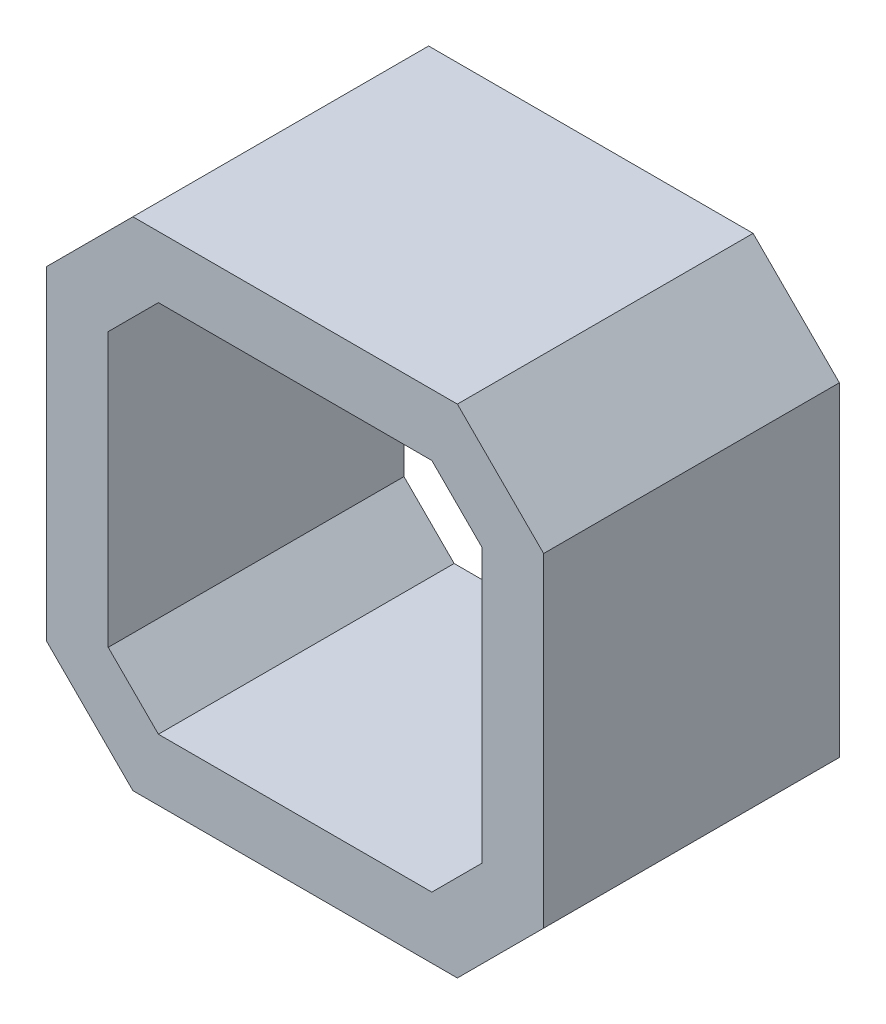
ISO-10303-21;
HEADER;
FILE_DESCRIPTION(('STEP AP214'),'2;1');
FILE_NAME('part.step','',(''),(''),'','','');
FILE_SCHEMA(('AUTOMOTIVE_DESIGN { 1 0 10303 214 1 1 1 1 }'));
ENDSEC;
DATA;
#1=APPLICATION_CONTEXT('core data for automotive mechanical design processes');
#2=APPLICATION_PROTOCOL_DEFINITION('international standard','automotive_design',2000,#1);
#3=PRODUCT_CONTEXT('',#1,'mechanical');
#4=PRODUCT('Part','Part','',(#3));
#5=PRODUCT_RELATED_PRODUCT_CATEGORY('part','',(#4));
#6=PRODUCT_DEFINITION_FORMATION('','',#4);
#7=PRODUCT_DEFINITION_CONTEXT('part definition',#1,'design');
#8=PRODUCT_DEFINITION('design','',#6,#7);
#9=PRODUCT_DEFINITION_SHAPE('','',#8);
#10=(LENGTH_UNIT() NAMED_UNIT(*) SI_UNIT(.MILLI.,.METRE.));
#11=(NAMED_UNIT(*) PLANE_ANGLE_UNIT() SI_UNIT($,.RADIAN.));
#12=(NAMED_UNIT(*) SI_UNIT($,.STERADIAN.) SOLID_ANGLE_UNIT());
#13=UNCERTAINTY_MEASURE_WITH_UNIT(LENGTH_MEASURE(1.E-05),#10,'distance_accuracy_value','');
#14=(GEOMETRIC_REPRESENTATION_CONTEXT(3) GLOBAL_UNCERTAINTY_ASSIGNED_CONTEXT((#13)) GLOBAL_UNIT_ASSIGNED_CONTEXT((#10,
#11,#12)) REPRESENTATION_CONTEXT('',''));
#15=CARTESIAN_POINT('',(0.,0.,0.));
#16=DIRECTION('',(0.,0.,1.));
#17=DIRECTION('',(1.,0.,0.));
#18=AXIS2_PLACEMENT_3D('',#15,#16,#17);
#19=CARTESIAN_POINT('',(0.,0.,54.));
#20=DIRECTION('',(0.,0.,-1.));
#21=DIRECTION('',(-1.,0.,0.));
#22=AXIS2_PLACEMENT_3D('',#19,#20,#21);
#23=PLANE('',#22);
#24=DIRECTION('',(-1.,0.,0.));
#25=VECTOR('',#24,1.);
#26=CARTESIAN_POINT('',(19.75,30.25,54.));
#27=LINE('',#26,#25);
#28=CARTESIAN_POINT('',(19.75,30.25,54.));
#29=VERTEX_POINT('',#28);
#30=CARTESIAN_POINT('',(-19.75,30.25,54.));
#31=VERTEX_POINT('',#30);
#32=EDGE_CURVE('E213',#29,#31,#27,.T.);
#33=ORIENTED_EDGE('',*,*,#32,.T.);
#34=DIRECTION('',(-0.707106781186548,-0.707106781186548,0.));
#35=VECTOR('',#34,1.);
#36=CARTESIAN_POINT('',(-19.75,30.25,54.));
#37=LINE('',#36,#35);
#38=CARTESIAN_POINT('',(-30.25,19.75,54.));
#39=VERTEX_POINT('',#38);
#40=EDGE_CURVE('E216',#31,#39,#37,.T.);
#41=ORIENTED_EDGE('',*,*,#40,.T.);
#42=DIRECTION('',(0.,-1.,0.));
#43=VECTOR('',#42,1.);
#44=CARTESIAN_POINT('',(-30.25,-19.75,54.));
#45=LINE('',#44,#43);
#46=CARTESIAN_POINT('',(-30.25,-19.75,54.));
#47=VERTEX_POINT('',#46);
#48=EDGE_CURVE('E219',#39,#47,#45,.T.);
#49=ORIENTED_EDGE('',*,*,#48,.T.);
#50=DIRECTION('',(0.707106781186548,-0.707106781186547,0.));
#51=VECTOR('',#50,1.);
#52=CARTESIAN_POINT('',(-19.75,-30.25,54.));
#53=LINE('',#52,#51);
#54=CARTESIAN_POINT('',(-19.75,-30.25,54.));
#55=VERTEX_POINT('',#54);
#56=EDGE_CURVE('E221',#47,#55,#53,.T.);
#57=ORIENTED_EDGE('',*,*,#56,.T.);
#58=DIRECTION('',(1.,0.,0.));
#59=VECTOR('',#58,1.);
#60=CARTESIAN_POINT('',(19.75,-30.25,54.));
#61=LINE('',#60,#59);
#62=CARTESIAN_POINT('',(19.75,-30.25,54.));
#63=VERTEX_POINT('',#62);
#64=EDGE_CURVE('E223',#55,#63,#61,.T.);
#65=ORIENTED_EDGE('',*,*,#64,.T.);
#66=DIRECTION('',(0.707106781186548,0.707106781186547,0.));
#67=VECTOR('',#66,1.);
#68=CARTESIAN_POINT('',(30.25,-19.75,54.));
#69=LINE('',#68,#67);
#70=CARTESIAN_POINT('',(30.25,-19.75,54.));
#71=VERTEX_POINT('',#70);
#72=EDGE_CURVE('E225',#63,#71,#69,.T.);
#73=ORIENTED_EDGE('',*,*,#72,.T.);
#74=DIRECTION('',(0.,1.,0.));
#75=VECTOR('',#74,1.);
#76=CARTESIAN_POINT('',(30.25,-19.75,54.));
#77=LINE('',#76,#75);
#78=CARTESIAN_POINT('',(30.25,19.75,54.));
#79=VERTEX_POINT('',#78);
#80=EDGE_CURVE('E227',#71,#79,#77,.T.);
#81=ORIENTED_EDGE('',*,*,#80,.T.);
#82=DIRECTION('',(-0.707106781186548,0.707106781186548,0.));
#83=VECTOR('',#82,1.);
#84=CARTESIAN_POINT('',(30.25,19.75,54.));
#85=LINE('',#84,#83);
#86=EDGE_CURVE('E229',#79,#29,#85,.T.);
#87=ORIENTED_EDGE('',*,*,#86,.T.);
#88=EDGE_LOOP('',(#33,#41,#49,#57,#65,#73,#81,#87));
#89=FACE_BOUND('',#88,.T.);
#90=DIRECTION('',(-0.707106781186548,0.707106781186548,0.));
#91=VECTOR('',#90,1.);
#92=CARTESIAN_POINT('',(22.75,16.6433982822018,54.));
#93=LINE('',#92,#91);
#94=CARTESIAN_POINT('',(22.75,16.6433982822018,54.));
#95=VERTEX_POINT('',#94);
#96=CARTESIAN_POINT('',(16.6433982822018,22.75,54.));
#97=VERTEX_POINT('',#96);
#98=EDGE_CURVE('E148',#95,#97,#93,.T.);
#99=ORIENTED_EDGE('',*,*,#98,.F.);
#100=DIRECTION('',(0.,1.,0.));
#101=VECTOR('',#100,1.);
#102=CARTESIAN_POINT('',(22.75,-16.6433982822018,54.));
#103=LINE('',#102,#101);
#104=CARTESIAN_POINT('',(22.75,-16.6433982822018,54.));
#105=VERTEX_POINT('',#104);
#106=EDGE_CURVE('E181',#105,#95,#103,.T.);
#107=ORIENTED_EDGE('',*,*,#106,.F.);
#108=DIRECTION('',(0.707106781186548,0.707106781186547,0.));
#109=VECTOR('',#108,1.);
#110=CARTESIAN_POINT('',(22.75,-16.6433982822018,54.));
#111=LINE('',#110,#109);
#112=CARTESIAN_POINT('',(16.6433982822018,-22.75,54.));
#113=VERTEX_POINT('',#112);
#114=EDGE_CURVE('E179',#113,#105,#111,.T.);
#115=ORIENTED_EDGE('',*,*,#114,.F.);
#116=DIRECTION('',(1.,0.,0.));
#117=VECTOR('',#116,1.);
#118=CARTESIAN_POINT('',(16.6433982822018,-22.75,54.));
#119=LINE('',#118,#117);
#120=CARTESIAN_POINT('',(-16.6433982822018,-22.75,54.));
#121=VERTEX_POINT('',#120);
#122=EDGE_CURVE('E177',#121,#113,#119,.T.);
#123=ORIENTED_EDGE('',*,*,#122,.F.);
#124=DIRECTION('',(0.707106781186548,-0.707106781186547,0.));
#125=VECTOR('',#124,1.);
#126=CARTESIAN_POINT('',(-16.6433982822018,-22.75,54.));
#127=LINE('',#126,#125);
#128=CARTESIAN_POINT('',(-22.75,-16.6433982822018,54.));
#129=VERTEX_POINT('',#128);
#130=EDGE_CURVE('E175',#129,#121,#127,.T.);
#131=ORIENTED_EDGE('',*,*,#130,.F.);
#132=DIRECTION('',(0.,-1.,0.));
#133=VECTOR('',#132,1.);
#134=CARTESIAN_POINT('',(-22.75,-16.6433982822018,54.));
#135=LINE('',#134,#133);
#136=CARTESIAN_POINT('',(-22.75,16.6433982822018,54.));
#137=VERTEX_POINT('',#136);
#138=EDGE_CURVE('E171',#137,#129,#135,.T.);
#139=ORIENTED_EDGE('',*,*,#138,.F.);
#140=DIRECTION('',(-0.707106781186547,-0.707106781186548,0.));
#141=VECTOR('',#140,1.);
#142=CARTESIAN_POINT('',(-16.6433982822018,22.75,54.));
#143=LINE('',#142,#141);
#144=CARTESIAN_POINT('',(-16.6433982822018,22.75,54.));
#145=VERTEX_POINT('',#144);
#146=EDGE_CURVE('E169',#145,#137,#143,.T.);
#147=ORIENTED_EDGE('',*,*,#146,.F.);
#148=DIRECTION('',(-1.,0.,0.));
#149=VECTOR('',#148,1.);
#150=CARTESIAN_POINT('',(16.6433982822018,22.75,54.));
#151=LINE('',#150,#149);
#152=EDGE_CURVE('E156',#97,#145,#151,.T.);
#153=ORIENTED_EDGE('',*,*,#152,.F.);
#154=EDGE_LOOP('',(#99,#107,#115,#123,#131,#139,#147,#153));
#155=FACE_BOUND('',#154,.T.);
#156=ADVANCED_FACE('F35',(#89,#155),#23,.F.);
#157=CARTESIAN_POINT('',(0.,0.,18.));
#158=DIRECTION('',(0.,0.,-1.));
#159=DIRECTION('',(-1.,0.,0.));
#160=AXIS2_PLACEMENT_3D('',#157,#158,#159);
#161=PLANE('',#160);
#162=DIRECTION('',(-1.,0.,0.));
#163=VECTOR('',#162,1.);
#164=CARTESIAN_POINT('',(19.75,30.25,18.));
#165=LINE('',#164,#163);
#166=CARTESIAN_POINT('',(19.75,30.25,18.));
#167=VERTEX_POINT('',#166);
#168=CARTESIAN_POINT('',(-19.75,30.25,18.));
#169=VERTEX_POINT('',#168);
#170=EDGE_CURVE('E164',#167,#169,#165,.T.);
#171=ORIENTED_EDGE('',*,*,#170,.F.);
#172=DIRECTION('',(-0.707106781186548,0.707106781186548,0.));
#173=VECTOR('',#172,1.);
#174=CARTESIAN_POINT('',(30.25,19.75,18.));
#175=LINE('',#174,#173);
#176=CARTESIAN_POINT('',(30.25,19.75,18.));
#177=VERTEX_POINT('',#176);
#178=EDGE_CURVE('E217',#177,#167,#175,.T.);
#179=ORIENTED_EDGE('',*,*,#178,.F.);
#180=DIRECTION('',(0.,1.,0.));
#181=VECTOR('',#180,1.);
#182=CARTESIAN_POINT('',(30.25,-19.75,18.));
#183=LINE('',#182,#181);
#184=CARTESIAN_POINT('',(30.25,-19.75,18.));
#185=VERTEX_POINT('',#184);
#186=EDGE_CURVE('E244',#185,#177,#183,.T.);
#187=ORIENTED_EDGE('',*,*,#186,.F.);
#188=DIRECTION('',(0.707106781186548,0.707106781186547,0.));
#189=VECTOR('',#188,1.);
#190=CARTESIAN_POINT('',(30.25,-19.75,18.));
#191=LINE('',#190,#189);
#192=CARTESIAN_POINT('',(19.75,-30.25,18.));
#193=VERTEX_POINT('',#192);
#194=EDGE_CURVE('E242',#193,#185,#191,.T.);
#195=ORIENTED_EDGE('',*,*,#194,.F.);
#196=DIRECTION('',(1.,0.,0.));
#197=VECTOR('',#196,1.);
#198=CARTESIAN_POINT('',(19.75,-30.25,18.));
#199=LINE('',#198,#197);
#200=CARTESIAN_POINT('',(-19.75,-30.25,18.));
#201=VERTEX_POINT('',#200);
#202=EDGE_CURVE('E240',#201,#193,#199,.T.);
#203=ORIENTED_EDGE('',*,*,#202,.F.);
#204=DIRECTION('',(0.707106781186548,-0.707106781186547,0.));
#205=VECTOR('',#204,1.);
#206=CARTESIAN_POINT('',(-19.75,-30.25,18.));
#207=LINE('',#206,#205);
#208=CARTESIAN_POINT('',(-30.25,-19.75,18.));
#209=VERTEX_POINT('',#208);
#210=EDGE_CURVE('E238',#209,#201,#207,.T.);
#211=ORIENTED_EDGE('',*,*,#210,.F.);
#212=DIRECTION('',(0.,-1.,0.));
#213=VECTOR('',#212,1.);
#214=CARTESIAN_POINT('',(-30.25,-19.75,18.));
#215=LINE('',#214,#213);
#216=CARTESIAN_POINT('',(-30.25,19.75,18.));
#217=VERTEX_POINT('',#216);
#218=EDGE_CURVE('E236',#217,#209,#215,.T.);
#219=ORIENTED_EDGE('',*,*,#218,.F.);
#220=DIRECTION('',(-0.707106781186548,-0.707106781186548,0.));
#221=VECTOR('',#220,1.);
#222=CARTESIAN_POINT('',(-19.75,30.25,18.));
#223=LINE('',#222,#221);
#224=EDGE_CURVE('E234',#169,#217,#223,.T.);
#225=ORIENTED_EDGE('',*,*,#224,.F.);
#226=EDGE_LOOP('',(#171,#179,#187,#195,#203,#211,#219,#225));
#227=FACE_BOUND('',#226,.T.);
#228=DIRECTION('',(0.,1.,0.));
#229=VECTOR('',#228,1.);
#230=CARTESIAN_POINT('',(22.75,-16.6433982822018,18.));
#231=LINE('',#230,#229);
#232=CARTESIAN_POINT('',(22.75,-16.6433982822018,18.));
#233=VERTEX_POINT('',#232);
#234=CARTESIAN_POINT('',(22.75,16.6433982822018,18.));
#235=VERTEX_POINT('',#234);
#236=EDGE_CURVE('E157',#233,#235,#231,.T.);
#237=ORIENTED_EDGE('',*,*,#236,.T.);
#238=DIRECTION('',(-0.707106781186548,0.707106781186548,0.));
#239=VECTOR('',#238,1.);
#240=CARTESIAN_POINT('',(22.75,16.6433982822018,18.));
#241=LINE('',#240,#239);
#242=CARTESIAN_POINT('',(16.6433982822018,22.75,18.));
#243=VERTEX_POINT('',#242);
#244=EDGE_CURVE('E58',#235,#243,#241,.T.);
#245=ORIENTED_EDGE('',*,*,#244,.T.);
#246=DIRECTION('',(-1.,0.,0.));
#247=VECTOR('',#246,1.);
#248=CARTESIAN_POINT('',(16.6433982822018,22.75,18.));
#249=LINE('',#248,#247);
#250=CARTESIAN_POINT('',(-16.6433982822018,22.75,18.));
#251=VERTEX_POINT('',#250);
#252=EDGE_CURVE('E163',#243,#251,#249,.T.);
#253=ORIENTED_EDGE('',*,*,#252,.T.);
#254=DIRECTION('',(-0.707106781186547,-0.707106781186548,0.));
#255=VECTOR('',#254,1.);
#256=CARTESIAN_POINT('',(-16.6433982822018,22.75,18.));
#257=LINE('',#256,#255);
#258=CARTESIAN_POINT('',(-22.75,16.6433982822018,18.));
#259=VERTEX_POINT('',#258);
#260=EDGE_CURVE('E185',#251,#259,#257,.T.);
#261=ORIENTED_EDGE('',*,*,#260,.T.);
#262=DIRECTION('',(0.,-1.,0.));
#263=VECTOR('',#262,1.);
#264=CARTESIAN_POINT('',(-22.75,-16.6433982822018,18.));
#265=LINE('',#264,#263);
#266=CARTESIAN_POINT('',(-22.75,-16.6433982822018,18.));
#267=VERTEX_POINT('',#266);
#268=EDGE_CURVE('E188',#259,#267,#265,.T.);
#269=ORIENTED_EDGE('',*,*,#268,.T.);
#270=DIRECTION('',(0.707106781186548,-0.707106781186547,0.));
#271=VECTOR('',#270,1.);
#272=CARTESIAN_POINT('',(-16.6433982822018,-22.75,18.));
#273=LINE('',#272,#271);
#274=CARTESIAN_POINT('',(-16.6433982822018,-22.75,18.));
#275=VERTEX_POINT('',#274);
#276=EDGE_CURVE('E191',#267,#275,#273,.T.);
#277=ORIENTED_EDGE('',*,*,#276,.T.);
#278=DIRECTION('',(1.,0.,0.));
#279=VECTOR('',#278,1.);
#280=CARTESIAN_POINT('',(16.6433982822018,-22.75,18.));
#281=LINE('',#280,#279);
#282=CARTESIAN_POINT('',(16.6433982822018,-22.75,18.));
#283=VERTEX_POINT('',#282);
#284=EDGE_CURVE('E194',#275,#283,#281,.T.);
#285=ORIENTED_EDGE('',*,*,#284,.T.);
#286=DIRECTION('',(0.707106781186548,0.707106781186547,0.));
#287=VECTOR('',#286,1.);
#288=CARTESIAN_POINT('',(22.75,-16.6433982822018,18.));
#289=LINE('',#288,#287);
#290=EDGE_CURVE('E197',#283,#233,#289,.T.);
#291=ORIENTED_EDGE('',*,*,#290,.T.);
#292=EDGE_LOOP('',(#237,#245,#253,#261,#269,#277,#285,#291));
#293=FACE_BOUND('',#292,.T.);
#294=ADVANCED_FACE('F274',(#227,#293),#161,.T.);
#295=CARTESIAN_POINT('',(19.75,30.25,54.));
#296=DIRECTION('',(0.,-1.,0.));
#297=DIRECTION('',(1.,0.,0.));
#298=AXIS2_PLACEMENT_3D('',#295,#296,#297);
#299=PLANE('',#298);
#300=ORIENTED_EDGE('',*,*,#170,.T.);
#301=DIRECTION('',(0.,0.,-1.));
#302=VECTOR('',#301,1.);
#303=CARTESIAN_POINT('',(-19.75,30.25,54.));
#304=LINE('',#303,#302);
#305=EDGE_CURVE('E11',#31,#169,#304,.T.);
#306=ORIENTED_EDGE('',*,*,#305,.F.);
#307=ORIENTED_EDGE('',*,*,#32,.F.);
#308=DIRECTION('',(0.,0.,-1.));
#309=VECTOR('',#308,1.);
#310=CARTESIAN_POINT('',(19.75,30.25,54.));
#311=LINE('',#310,#309);
#312=EDGE_CURVE('E231',#29,#167,#311,.T.);
#313=ORIENTED_EDGE('',*,*,#312,.T.);
#314=EDGE_LOOP('',(#300,#306,#307,#313));
#315=FACE_BOUND('',#314,.T.);
#316=ADVANCED_FACE('F37',(#315),#299,.F.);
#317=CARTESIAN_POINT('',(-19.75,30.25,54.));
#318=DIRECTION('',(0.707106781186548,-0.707106781186548,0.));
#319=DIRECTION('',(0.707106781186548,0.707106781186548,0.));
#320=AXIS2_PLACEMENT_3D('',#317,#318,#319);
#321=PLANE('',#320);
#322=ORIENTED_EDGE('',*,*,#224,.T.);
#323=DIRECTION('',(0.,0.,-1.));
#324=VECTOR('',#323,1.);
#325=CARTESIAN_POINT('',(-30.25,19.75,54.));
#326=LINE('',#325,#324);
#327=EDGE_CURVE('E43',#39,#217,#326,.T.);
#328=ORIENTED_EDGE('',*,*,#327,.F.);
#329=ORIENTED_EDGE('',*,*,#40,.F.);
#330=ORIENTED_EDGE('',*,*,#305,.T.);
#331=EDGE_LOOP('',(#322,#328,#329,#330));
#332=FACE_BOUND('',#331,.T.);
#333=ADVANCED_FACE('F291',(#332),#321,.F.);
#334=CARTESIAN_POINT('',(-30.25,-19.75,54.));
#335=DIRECTION('',(1.,0.,0.));
#336=DIRECTION('',(0.,0.,-1.));
#337=AXIS2_PLACEMENT_3D('',#334,#335,#336);
#338=PLANE('',#337);
#339=ORIENTED_EDGE('',*,*,#218,.T.);
#340=DIRECTION('',(0.,0.,-1.));
#341=VECTOR('',#340,1.);
#342=CARTESIAN_POINT('',(-30.25,-19.75,54.));
#343=LINE('',#342,#341);
#344=EDGE_CURVE('E261',#47,#209,#343,.T.);
#345=ORIENTED_EDGE('',*,*,#344,.F.);
#346=ORIENTED_EDGE('',*,*,#48,.F.);
#347=ORIENTED_EDGE('',*,*,#327,.T.);
#348=EDGE_LOOP('',(#339,#345,#346,#347));
#349=FACE_BOUND('',#348,.T.);
#350=ADVANCED_FACE('F268',(#349),#338,.F.);
#351=CARTESIAN_POINT('',(-19.75,-30.25,54.));
#352=DIRECTION('',(0.707106781186547,0.707106781186548,0.));
#353=DIRECTION('',(-0.707106781186548,0.707106781186547,0.));
#354=AXIS2_PLACEMENT_3D('',#351,#352,#353);
#355=PLANE('',#354);
#356=ORIENTED_EDGE('',*,*,#210,.T.);
#357=DIRECTION('',(0.,0.,-1.));
#358=VECTOR('',#357,1.);
#359=CARTESIAN_POINT('',(-19.75,-30.25,54.));
#360=LINE('',#359,#358);
#361=EDGE_CURVE('E258',#55,#201,#360,.T.);
#362=ORIENTED_EDGE('',*,*,#361,.F.);
#363=ORIENTED_EDGE('',*,*,#56,.F.);
#364=ORIENTED_EDGE('',*,*,#344,.T.);
#365=EDGE_LOOP('',(#356,#362,#363,#364));
#366=FACE_BOUND('',#365,.T.);
#367=ADVANCED_FACE('F280',(#366),#355,.F.);
#368=CARTESIAN_POINT('',(19.75,-30.25,54.));
#369=DIRECTION('',(0.,1.,0.));
#370=DIRECTION('',(-1.,0.,0.));
#371=AXIS2_PLACEMENT_3D('',#368,#369,#370);
#372=PLANE('',#371);
#373=ORIENTED_EDGE('',*,*,#202,.T.);
#374=DIRECTION('',(0.,0.,-1.));
#375=VECTOR('',#374,1.);
#376=CARTESIAN_POINT('',(19.75,-30.25,54.));
#377=LINE('',#376,#375);
#378=EDGE_CURVE('E255',#63,#193,#377,.T.);
#379=ORIENTED_EDGE('',*,*,#378,.F.);
#380=ORIENTED_EDGE('',*,*,#64,.F.);
#381=ORIENTED_EDGE('',*,*,#361,.T.);
#382=EDGE_LOOP('',(#373,#379,#380,#381));
#383=FACE_BOUND('',#382,.T.);
#384=ADVANCED_FACE('F284',(#383),#372,.F.);
#385=CARTESIAN_POINT('',(30.25,-19.75,54.));
#386=DIRECTION('',(-0.707106781186547,0.707106781186548,0.));
#387=DIRECTION('',(-0.707106781186548,-0.707106781186547,0.));
#388=AXIS2_PLACEMENT_3D('',#385,#386,#387);
#389=PLANE('',#388);
#390=ORIENTED_EDGE('',*,*,#194,.T.);
#391=DIRECTION('',(0.,0.,-1.));
#392=VECTOR('',#391,1.);
#393=CARTESIAN_POINT('',(30.25,-19.75,54.));
#394=LINE('',#393,#392);
#395=EDGE_CURVE('E252',#71,#185,#394,.T.);
#396=ORIENTED_EDGE('',*,*,#395,.F.);
#397=ORIENTED_EDGE('',*,*,#72,.F.);
#398=ORIENTED_EDGE('',*,*,#378,.T.);
#399=EDGE_LOOP('',(#390,#396,#397,#398));
#400=FACE_BOUND('',#399,.T.);
#401=ADVANCED_FACE('F304',(#400),#389,.F.);
#402=CARTESIAN_POINT('',(30.25,-19.75,54.));
#403=DIRECTION('',(-1.,0.,0.));
#404=DIRECTION('',(0.,0.,1.));
#405=AXIS2_PLACEMENT_3D('',#402,#403,#404);
#406=PLANE('',#405);
#407=ORIENTED_EDGE('',*,*,#186,.T.);
#408=DIRECTION('',(0.,0.,-1.));
#409=VECTOR('',#408,1.);
#410=CARTESIAN_POINT('',(30.25,19.75,54.));
#411=LINE('',#410,#409);
#412=EDGE_CURVE('E249',#79,#177,#411,.T.);
#413=ORIENTED_EDGE('',*,*,#412,.F.);
#414=ORIENTED_EDGE('',*,*,#80,.F.);
#415=ORIENTED_EDGE('',*,*,#395,.T.);
#416=EDGE_LOOP('',(#407,#413,#414,#415));
#417=FACE_BOUND('',#416,.T.);
#418=ADVANCED_FACE('F302',(#417),#406,.F.);
#419=CARTESIAN_POINT('',(30.25,19.75,54.));
#420=DIRECTION('',(-0.707106781186548,-0.707106781186548,0.));
#421=DIRECTION('',(0.707106781186548,-0.707106781186548,0.));
#422=AXIS2_PLACEMENT_3D('',#419,#420,#421);
#423=PLANE('',#422);
#424=ORIENTED_EDGE('',*,*,#178,.T.);
#425=ORIENTED_EDGE('',*,*,#312,.F.);
#426=ORIENTED_EDGE('',*,*,#86,.F.);
#427=ORIENTED_EDGE('',*,*,#412,.T.);
#428=EDGE_LOOP('',(#424,#425,#426,#427));
#429=FACE_BOUND('',#428,.T.);
#430=ADVANCED_FACE('F297',(#429),#423,.F.);
#431=CARTESIAN_POINT('',(22.75,16.6433982822018,54.));
#432=DIRECTION('',(-0.707106781186548,-0.707106781186548,0.));
#433=DIRECTION('',(0.707106781186548,-0.707106781186548,0.));
#434=AXIS2_PLACEMENT_3D('',#431,#432,#433);
#435=PLANE('',#434);
#436=ORIENTED_EDGE('',*,*,#244,.F.);
#437=DIRECTION('',(0.,0.,-1.));
#438=VECTOR('',#437,1.);
#439=CARTESIAN_POINT('',(22.75,16.6433982822018,54.));
#440=LINE('',#439,#438);
#441=EDGE_CURVE('E152',#95,#235,#440,.T.);
#442=ORIENTED_EDGE('',*,*,#441,.F.);
#443=ORIENTED_EDGE('',*,*,#98,.T.);
#444=DIRECTION('',(0.,0.,-1.));
#445=VECTOR('',#444,1.);
#446=CARTESIAN_POINT('',(16.6433982822018,22.75,54.));
#447=LINE('',#446,#445);
#448=EDGE_CURVE('E151',#97,#243,#447,.T.);
#449=ORIENTED_EDGE('',*,*,#448,.T.);
#450=EDGE_LOOP('',(#436,#442,#443,#449));
#451=FACE_BOUND('',#450,.T.);
#452=ADVANCED_FACE('F150',(#451),#435,.T.);
#453=CARTESIAN_POINT('',(16.6433982822018,22.75,54.));
#454=DIRECTION('',(0.,-1.,0.));
#455=DIRECTION('',(1.,0.,0.));
#456=AXIS2_PLACEMENT_3D('',#453,#454,#455);
#457=PLANE('',#456);
#458=ORIENTED_EDGE('',*,*,#252,.F.);
#459=ORIENTED_EDGE('',*,*,#448,.F.);
#460=ORIENTED_EDGE('',*,*,#152,.T.);
#461=DIRECTION('',(0.,0.,-1.));
#462=VECTOR('',#461,1.);
#463=CARTESIAN_POINT('',(-16.6433982822018,22.75,54.));
#464=LINE('',#463,#462);
#465=EDGE_CURVE('E165',#145,#251,#464,.T.);
#466=ORIENTED_EDGE('',*,*,#465,.T.);
#467=EDGE_LOOP('',(#458,#459,#460,#466));
#468=FACE_BOUND('',#467,.T.);
#469=ADVANCED_FACE('F160',(#468),#457,.T.);
#470=CARTESIAN_POINT('',(-16.6433982822018,22.75,54.));
#471=DIRECTION('',(0.707106781186548,-0.707106781186547,0.));
#472=DIRECTION('',(0.707106781186547,0.707106781186548,0.));
#473=AXIS2_PLACEMENT_3D('',#470,#471,#472);
#474=PLANE('',#473);
#475=ORIENTED_EDGE('',*,*,#260,.F.);
#476=ORIENTED_EDGE('',*,*,#465,.F.);
#477=ORIENTED_EDGE('',*,*,#146,.T.);
#478=DIRECTION('',(0.,0.,-1.));
#479=VECTOR('',#478,1.);
#480=CARTESIAN_POINT('',(-22.75,16.6433982822018,54.));
#481=LINE('',#480,#479);
#482=EDGE_CURVE('E210',#137,#259,#481,.T.);
#483=ORIENTED_EDGE('',*,*,#482,.T.);
#484=EDGE_LOOP('',(#475,#476,#477,#483));
#485=FACE_BOUND('',#484,.T.);
#486=ADVANCED_FACE('F329',(#485),#474,.T.);
#487=CARTESIAN_POINT('',(-22.75,-16.6433982822018,54.));
#488=DIRECTION('',(1.,0.,0.));
#489=DIRECTION('',(0.,0.,-1.));
#490=AXIS2_PLACEMENT_3D('',#487,#488,#489);
#491=PLANE('',#490);
#492=ORIENTED_EDGE('',*,*,#268,.F.);
#493=ORIENTED_EDGE('',*,*,#482,.F.);
#494=ORIENTED_EDGE('',*,*,#138,.T.);
#495=DIRECTION('',(0.,0.,-1.));
#496=VECTOR('',#495,1.);
#497=CARTESIAN_POINT('',(-22.75,-16.6433982822018,54.));
#498=LINE('',#497,#496);
#499=EDGE_CURVE('E208',#129,#267,#498,.T.);
#500=ORIENTED_EDGE('',*,*,#499,.T.);
#501=EDGE_LOOP('',(#492,#493,#494,#500));
#502=FACE_BOUND('',#501,.T.);
#503=ADVANCED_FACE('F333',(#502),#491,.T.);
#504=CARTESIAN_POINT('',(-16.6433982822018,-22.75,54.));
#505=DIRECTION('',(0.707106781186547,0.707106781186548,0.));
#506=DIRECTION('',(-0.707106781186548,0.707106781186547,0.));
#507=AXIS2_PLACEMENT_3D('',#504,#505,#506);
#508=PLANE('',#507);
#509=ORIENTED_EDGE('',*,*,#276,.F.);
#510=ORIENTED_EDGE('',*,*,#499,.F.);
#511=ORIENTED_EDGE('',*,*,#130,.T.);
#512=DIRECTION('',(0.,0.,-1.));
#513=VECTOR('',#512,1.);
#514=CARTESIAN_POINT('',(-16.6433982822018,-22.75,54.));
#515=LINE('',#514,#513);
#516=EDGE_CURVE('E206',#121,#275,#515,.T.);
#517=ORIENTED_EDGE('',*,*,#516,.T.);
#518=EDGE_LOOP('',(#509,#510,#511,#517));
#519=FACE_BOUND('',#518,.T.);
#520=ADVANCED_FACE('F339',(#519),#508,.T.);
#521=CARTESIAN_POINT('',(16.6433982822018,-22.75,54.));
#522=DIRECTION('',(0.,1.,0.));
#523=DIRECTION('',(-1.,0.,0.));
#524=AXIS2_PLACEMENT_3D('',#521,#522,#523);
#525=PLANE('',#524);
#526=ORIENTED_EDGE('',*,*,#284,.F.);
#527=ORIENTED_EDGE('',*,*,#516,.F.);
#528=ORIENTED_EDGE('',*,*,#122,.T.);
#529=DIRECTION('',(0.,0.,-1.));
#530=VECTOR('',#529,1.);
#531=CARTESIAN_POINT('',(16.6433982822018,-22.75,54.));
#532=LINE('',#531,#530);
#533=EDGE_CURVE('E204',#113,#283,#532,.T.);
#534=ORIENTED_EDGE('',*,*,#533,.T.);
#535=EDGE_LOOP('',(#526,#527,#528,#534));
#536=FACE_BOUND('',#535,.T.);
#537=ADVANCED_FACE('F343',(#536),#525,.T.);
#538=CARTESIAN_POINT('',(22.75,-16.6433982822018,54.));
#539=DIRECTION('',(-0.707106781186547,0.707106781186548,0.));
#540=DIRECTION('',(-0.707106781186548,-0.707106781186547,0.));
#541=AXIS2_PLACEMENT_3D('',#538,#539,#540);
#542=PLANE('',#541);
#543=ORIENTED_EDGE('',*,*,#290,.F.);
#544=ORIENTED_EDGE('',*,*,#533,.F.);
#545=ORIENTED_EDGE('',*,*,#114,.T.);
#546=DIRECTION('',(0.,0.,-1.));
#547=VECTOR('',#546,1.);
#548=CARTESIAN_POINT('',(22.75,-16.6433982822018,54.));
#549=LINE('',#548,#547);
#550=EDGE_CURVE('E50',#105,#233,#549,.T.);
#551=ORIENTED_EDGE('',*,*,#550,.T.);
#552=EDGE_LOOP('',(#543,#544,#545,#551));
#553=FACE_BOUND('',#552,.T.);
#554=ADVANCED_FACE('F347',(#553),#542,.T.);
#555=CARTESIAN_POINT('',(22.75,-16.6433982822018,54.));
#556=DIRECTION('',(-1.,0.,0.));
#557=DIRECTION('',(0.,0.,1.));
#558=AXIS2_PLACEMENT_3D('',#555,#556,#557);
#559=PLANE('',#558);
#560=ORIENTED_EDGE('',*,*,#236,.F.);
#561=ORIENTED_EDGE('',*,*,#550,.F.);
#562=ORIENTED_EDGE('',*,*,#106,.T.);
#563=ORIENTED_EDGE('',*,*,#441,.T.);
#564=EDGE_LOOP('',(#560,#561,#562,#563));
#565=FACE_BOUND('',#564,.T.);
#566=ADVANCED_FACE('F351',(#565),#559,.T.);
#567=CLOSED_SHELL('',(#156,#294,#316,#333,#350,#367,#384,#401,#418,#430,#452,#469,#486,#503,
#520,#537,#554,#566));
#568=MANIFOLD_SOLID_BREP('B2',#567);
#569=ADVANCED_BREP_SHAPE_REPRESENTATION('',(#18,#568),#14);
#570=SHAPE_DEFINITION_REPRESENTATION(#9,#569);
ENDSEC;
END-ISO-10303-21;
